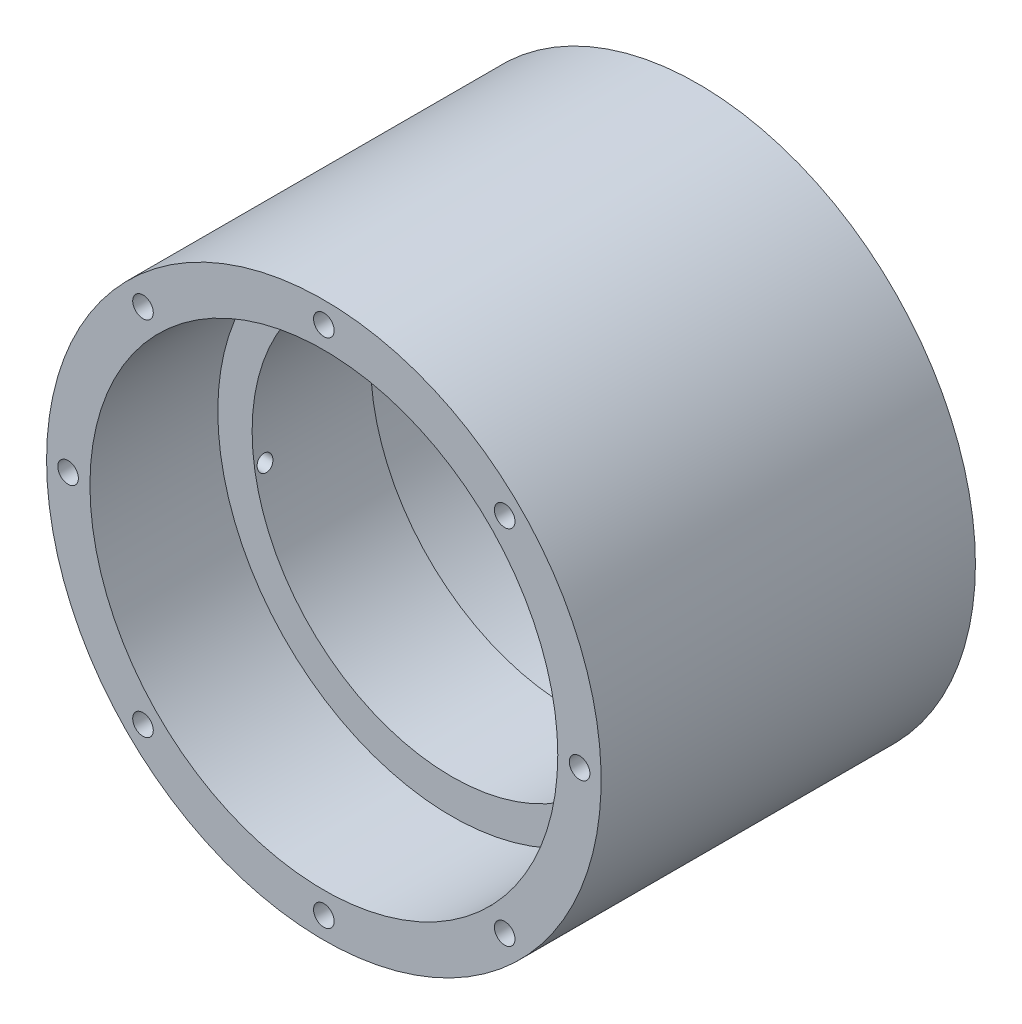
ISO-10303-21;
HEADER;
FILE_DESCRIPTION(('STEP AP214'),'2;1');
FILE_NAME('part.step','',(''),(''),'','','');
FILE_SCHEMA(('AUTOMOTIVE_DESIGN { 1 0 10303 214 1 1 1 1 }'));
ENDSEC;
DATA;
#1=APPLICATION_CONTEXT('core data for automotive mechanical design processes');
#2=APPLICATION_PROTOCOL_DEFINITION('international standard','automotive_design',2000,#1);
#3=PRODUCT_CONTEXT('',#1,'mechanical');
#4=PRODUCT('Part','Part','',(#3));
#5=PRODUCT_RELATED_PRODUCT_CATEGORY('part','',(#4));
#6=PRODUCT_DEFINITION_FORMATION('','',#4);
#7=PRODUCT_DEFINITION_CONTEXT('part definition',#1,'design');
#8=PRODUCT_DEFINITION('design','',#6,#7);
#9=PRODUCT_DEFINITION_SHAPE('','',#8);
#10=(LENGTH_UNIT() NAMED_UNIT(*) SI_UNIT(.MILLI.,.METRE.));
#11=(NAMED_UNIT(*) PLANE_ANGLE_UNIT() SI_UNIT($,.RADIAN.));
#12=(NAMED_UNIT(*) SI_UNIT($,.STERADIAN.) SOLID_ANGLE_UNIT());
#13=UNCERTAINTY_MEASURE_WITH_UNIT(LENGTH_MEASURE(1.E-05),#10,'distance_accuracy_value','');
#14=(GEOMETRIC_REPRESENTATION_CONTEXT(3) GLOBAL_UNCERTAINTY_ASSIGNED_CONTEXT((#13)) GLOBAL_UNIT_ASSIGNED_CONTEXT((#10,
#11,#12)) REPRESENTATION_CONTEXT('',''));
#15=CARTESIAN_POINT('',(0.,0.,0.));
#16=DIRECTION('',(0.,0.,1.));
#17=DIRECTION('',(1.,0.,0.));
#18=AXIS2_PLACEMENT_3D('',#15,#16,#17);
#19=CARTESIAN_POINT('',(-43.7241637998945,7.99999999999994,50.));
#20=DIRECTION('',(1.,0.,0.));
#21=DIRECTION('',(0.,0.,-1.));
#22=AXIS2_PLACEMENT_3D('',#19,#20,#21);
#23=PLANE('',#22);
#24=CARTESIAN_POINT('',(-43.7241637998945,5.14999999999991,15.5847480327554));
#25=DIRECTION('',(-1.,0.,0.));
#26=DIRECTION('',(0.,0.,1.));
#27=AXIS2_PLACEMENT_3D('',#24,#25,#26);
#28=CIRCLE('',#27,1.25);
#29=CARTESIAN_POINT('',(-43.7241637998945,5.14999999999991,16.8347480327554));
#30=VERTEX_POINT('',#29);
#31=EDGE_CURVE('E237',#30,#30,#28,.T.);
#32=ORIENTED_EDGE('',*,*,#31,.F.);
#33=EDGE_LOOP('',(#32));
#34=FACE_BOUND('',#33,.T.);
#35=DIRECTION('',(0.,-1.,0.));
#36=VECTOR('',#35,1.);
#37=CARTESIAN_POINT('',(-43.7241637998945,7.99999999999994,0.));
#38=LINE('',#37,#36);
#39=CARTESIAN_POINT('',(-43.7241637998945,7.99999999999996,0.));
#40=VERTEX_POINT('',#39);
#41=CARTESIAN_POINT('',(-43.7241637998945,-7.99999999999998,0.));
#42=VERTEX_POINT('',#41);
#43=EDGE_CURVE('E73',#40,#42,#38,.T.);
#44=ORIENTED_EDGE('',*,*,#43,.T.);
#45=DIRECTION('',(0.,0.,-1.));
#46=VECTOR('',#45,1.);
#47=CARTESIAN_POINT('',(-43.7241637998945,-7.99999999999998,50.));
#48=LINE('',#47,#46);
#49=CARTESIAN_POINT('',(-43.7241637998945,-7.99999999999998,50.));
#50=VERTEX_POINT('',#49);
#51=EDGE_CURVE('E66',#50,#42,#48,.T.);
#52=ORIENTED_EDGE('',*,*,#51,.F.);
#53=DIRECTION('',(0.,-1.,0.));
#54=VECTOR('',#53,1.);
#55=CARTESIAN_POINT('',(-43.7241637998945,7.99999999999994,50.));
#56=LINE('',#55,#54);
#57=CARTESIAN_POINT('',(-43.7241637998945,7.99999999999994,50.));
#58=VERTEX_POINT('',#57);
#59=EDGE_CURVE('E202',#58,#50,#56,.T.);
#60=ORIENTED_EDGE('',*,*,#59,.F.);
#61=DIRECTION('',(0.,0.,-1.));
#62=VECTOR('',#61,1.);
#63=CARTESIAN_POINT('',(-43.7241637998945,7.99999999999994,50.));
#64=LINE('',#63,#62);
#65=EDGE_CURVE('E60',#58,#40,#64,.T.);
#66=ORIENTED_EDGE('',*,*,#65,.T.);
#67=EDGE_LOOP('',(#44,#52,#60,#66));
#68=FACE_BOUND('',#67,.T.);
#69=CARTESIAN_POINT('',(-43.7241637998945,-5.05000000000007,37.8347480327554));
#70=DIRECTION('',(-1.,0.,0.));
#71=DIRECTION('',(0.,0.,1.));
#72=AXIS2_PLACEMENT_3D('',#69,#70,#71);
#73=CIRCLE('',#72,1.25);
#74=CARTESIAN_POINT('',(-43.7241637998945,-5.05000000000007,39.0847480327554));
#75=VERTEX_POINT('',#74);
#76=EDGE_CURVE('E228',#75,#75,#73,.T.);
#77=ORIENTED_EDGE('',*,*,#76,.F.);
#78=EDGE_LOOP('',(#77));
#79=FACE_BOUND('',#78,.T.);
#80=ADVANCED_FACE('F44',(#34,#68,#79),#23,.F.);
#81=CARTESIAN_POINT('',(0.,0.,60.));
#82=DIRECTION('',(0.,0.,-1.));
#83=DIRECTION('',(-1.,0.,0.));
#84=AXIS2_PLACEMENT_3D('',#81,#82,#83);
#85=CYLINDRICAL_SURFACE('',#84,44.45);
#86=ORIENTED_EDGE('',*,*,#51,.T.);
#87=CARTESIAN_POINT('',(0.,0.,0.));
#88=DIRECTION('',(0.,0.,-1.));
#89=DIRECTION('',(-1.,0.,0.));
#90=AXIS2_PLACEMENT_3D('',#87,#88,#89);
#91=CIRCLE('',#90,44.45);
#92=EDGE_CURVE('E53',#40,#42,#91,.T.);
#93=ORIENTED_EDGE('',*,*,#92,.F.);
#94=ORIENTED_EDGE('',*,*,#65,.F.);
#95=CARTESIAN_POINT('',(0.,0.,50.));
#96=DIRECTION('',(0.,0.,-1.));
#97=DIRECTION('',(-1.,0.,0.));
#98=AXIS2_PLACEMENT_3D('',#95,#96,#97);
#99=CIRCLE('',#98,44.45);
#100=EDGE_CURVE('E199',#50,#58,#99,.T.);
#101=ORIENTED_EDGE('',*,*,#100,.F.);
#102=EDGE_LOOP('',(#86,#93,#94,#101));
#103=FACE_BOUND('',#102,.T.);
#104=CARTESIAN_POINT('',(0.,0.,60.));
#105=DIRECTION('',(0.,0.,-1.));
#106=DIRECTION('',(-1.,0.,0.));
#107=AXIS2_PLACEMENT_3D('',#104,#105,#106);
#108=CIRCLE('',#107,44.45);
#109=CARTESIAN_POINT('',(-44.45,0.,60.));
#110=VERTEX_POINT('',#109);
#111=EDGE_CURVE('E11',#110,#110,#108,.T.);
#112=ORIENTED_EDGE('',*,*,#111,.T.);
#113=EDGE_LOOP('',(#112));
#114=FACE_BOUND('',#113,.T.);
#115=ADVANCED_FACE('F46',(#103,#114),#85,.T.);
#116=CARTESIAN_POINT('',(44.45,0.,60.));
#117=DIRECTION('',(0.,0.,1.));
#118=DIRECTION('',(1.,0.,0.));
#119=AXIS2_PLACEMENT_3D('',#116,#117,#118);
#120=PLANE('',#119);
#121=CARTESIAN_POINT('',(28.9913780286488,28.9913780286481,60.));
#122=DIRECTION('',(0.,0.,1.));
#123=DIRECTION('',(1.,0.,0.));
#124=AXIS2_PLACEMENT_3D('',#121,#122,#123);
#125=CIRCLE('',#124,1.65);
#126=CARTESIAN_POINT('',(30.6413780286488,28.9913780286481,60.));
#127=VERTEX_POINT('',#126);
#128=EDGE_CURVE('E110',#127,#127,#125,.T.);
#129=ORIENTED_EDGE('',*,*,#128,.F.);
#130=EDGE_LOOP('',(#129));
#131=FACE_BOUND('',#130,.T.);
#132=CARTESIAN_POINT('',(4.29452204677705E-13,41.,60.));
#133=DIRECTION('',(0.,0.,1.));
#134=DIRECTION('',(1.,0.,0.));
#135=AXIS2_PLACEMENT_3D('',#132,#133,#134);
#136=CIRCLE('',#135,1.65);
#137=CARTESIAN_POINT('',(1.65000000000043,41.,60.));
#138=VERTEX_POINT('',#137);
#139=EDGE_CURVE('E109',#138,#138,#136,.T.);
#140=ORIENTED_EDGE('',*,*,#139,.F.);
#141=EDGE_LOOP('',(#140));
#142=FACE_BOUND('',#141,.T.);
#143=CARTESIAN_POINT('',(-28.9913780286482,28.9913780286487,60.));
#144=DIRECTION('',(0.,0.,1.));
#145=DIRECTION('',(1.,0.,0.));
#146=AXIS2_PLACEMENT_3D('',#143,#144,#145);
#147=CIRCLE('',#146,1.65);
#148=CARTESIAN_POINT('',(-27.3413780286482,28.9913780286487,60.));
#149=VERTEX_POINT('',#148);
#150=EDGE_CURVE('E127',#149,#149,#147,.T.);
#151=ORIENTED_EDGE('',*,*,#150,.F.);
#152=EDGE_LOOP('',(#151));
#153=FACE_BOUND('',#152,.T.);
#154=CARTESIAN_POINT('',(-41.,2.86301469785137E-13,60.));
#155=DIRECTION('',(0.,0.,1.));
#156=DIRECTION('',(1.,0.,0.));
#157=AXIS2_PLACEMENT_3D('',#154,#155,#156);
#158=CIRCLE('',#157,1.65);
#159=CARTESIAN_POINT('',(-39.35,2.86301469785137E-13,60.));
#160=VERTEX_POINT('',#159);
#161=EDGE_CURVE('E135',#160,#160,#158,.T.);
#162=ORIENTED_EDGE('',*,*,#161,.F.);
#163=EDGE_LOOP('',(#162));
#164=FACE_BOUND('',#163,.T.);
#165=CARTESIAN_POINT('',(-28.9913780286486,-28.9913780286483,60.));
#166=DIRECTION('',(0.,0.,1.));
#167=DIRECTION('',(1.,0.,0.));
#168=AXIS2_PLACEMENT_3D('',#165,#166,#167);
#169=CIRCLE('',#168,1.65);
#170=CARTESIAN_POINT('',(-27.3413780286486,-28.9913780286483,60.));
#171=VERTEX_POINT('',#170);
#172=EDGE_CURVE('E143',#171,#171,#169,.T.);
#173=ORIENTED_EDGE('',*,*,#172,.F.);
#174=EDGE_LOOP('',(#173));
#175=FACE_BOUND('',#174,.T.);
#176=CARTESIAN_POINT('',(-1.43150734892569E-13,-41.,60.));
#177=DIRECTION('',(0.,0.,1.));
#178=DIRECTION('',(1.,0.,0.));
#179=AXIS2_PLACEMENT_3D('',#176,#177,#178);
#180=CIRCLE('',#179,1.65);
#181=CARTESIAN_POINT('',(1.64999999999986,-41.,60.));
#182=VERTEX_POINT('',#181);
#183=EDGE_CURVE('E151',#182,#182,#180,.T.);
#184=ORIENTED_EDGE('',*,*,#183,.F.);
#185=EDGE_LOOP('',(#184));
#186=FACE_BOUND('',#185,.T.);
#187=CARTESIAN_POINT('',(28.9913780286484,-28.9913780286485,60.));
#188=DIRECTION('',(0.,0.,1.));
#189=DIRECTION('',(1.,0.,0.));
#190=AXIS2_PLACEMENT_3D('',#187,#188,#189);
#191=CIRCLE('',#190,1.65);
#192=CARTESIAN_POINT('',(30.6413780286484,-28.9913780286485,60.));
#193=VERTEX_POINT('',#192);
#194=EDGE_CURVE('E159',#193,#193,#191,.T.);
#195=ORIENTED_EDGE('',*,*,#194,.F.);
#196=EDGE_LOOP('',(#195));
#197=FACE_BOUND('',#196,.T.);
#198=CARTESIAN_POINT('',(41.,0.,60.));
#199=DIRECTION('',(0.,0.,1.));
#200=DIRECTION('',(1.,0.,0.));
#201=AXIS2_PLACEMENT_3D('',#198,#199,#200);
#202=CIRCLE('',#201,1.65);
#203=CARTESIAN_POINT('',(42.65,0.,60.));
#204=VERTEX_POINT('',#203);
#205=EDGE_CURVE('E167',#204,#204,#202,.T.);
#206=ORIENTED_EDGE('',*,*,#205,.F.);
#207=EDGE_LOOP('',(#206));
#208=FACE_BOUND('',#207,.T.);
#209=CARTESIAN_POINT('',(0.,0.,60.));
#210=DIRECTION('',(0.,0.,-1.));
#211=DIRECTION('',(-1.,0.,0.));
#212=AXIS2_PLACEMENT_3D('',#209,#210,#211);
#213=CIRCLE('',#212,37.5);
#214=CARTESIAN_POINT('',(-37.5,0.,60.));
#215=VERTEX_POINT('',#214);
#216=EDGE_CURVE('E195',#215,#215,#213,.T.);
#217=ORIENTED_EDGE('',*,*,#216,.T.);
#218=EDGE_LOOP('',(#217));
#219=FACE_BOUND('',#218,.T.);
#220=ORIENTED_EDGE('',*,*,#111,.F.);
#221=EDGE_LOOP('',(#220));
#222=FACE_BOUND('',#221,.T.);
#223=ADVANCED_FACE('F282',(#131,#142,#153,#164,#175,#186,#197,#208,#219,#222),#120,.T.);
#224=CARTESIAN_POINT('',(0.,0.,0.));
#225=DIRECTION('',(0.,0.,-1.));
#226=DIRECTION('',(-1.,0.,0.));
#227=AXIS2_PLACEMENT_3D('',#224,#225,#226);
#228=PLANE('',#227);
#229=CARTESIAN_POINT('',(0.,0.,0.));
#230=DIRECTION('',(0.,0.,-1.));
#231=DIRECTION('',(-1.,0.,0.));
#232=AXIS2_PLACEMENT_3D('',#229,#230,#231);
#233=CIRCLE('',#232,37.5);
#234=CARTESIAN_POINT('',(-37.5,0.,0.));
#235=VERTEX_POINT('',#234);
#236=EDGE_CURVE('E191',#235,#235,#233,.T.);
#237=ORIENTED_EDGE('',*,*,#236,.F.);
#238=EDGE_LOOP('',(#237));
#239=FACE_BOUND('',#238,.T.);
#240=ORIENTED_EDGE('',*,*,#43,.F.);
#241=ORIENTED_EDGE('',*,*,#92,.T.);
#242=EDGE_LOOP('',(#240,#241));
#243=FACE_BOUND('',#242,.T.);
#244=ADVANCED_FACE('F216',(#239,#243),#228,.T.);
#245=CARTESIAN_POINT('',(0.,0.,50.));
#246=DIRECTION('',(0.,0.,-1.));
#247=DIRECTION('',(-1.,0.,0.));
#248=AXIS2_PLACEMENT_3D('',#245,#246,#247);
#249=PLANE('',#248);
#250=ORIENTED_EDGE('',*,*,#100,.T.);
#251=ORIENTED_EDGE('',*,*,#59,.T.);
#252=EDGE_LOOP('',(#250,#251));
#253=FACE_BOUND('',#252,.T.);
#254=ADVANCED_FACE('F221',(#253),#249,.T.);
#255=CARTESIAN_POINT('',(0.,0.,60.));
#256=DIRECTION('',(0.,0.,-1.));
#257=DIRECTION('',(-1.,0.,0.));
#258=AXIS2_PLACEMENT_3D('',#255,#256,#257);
#259=CYLINDRICAL_SURFACE('',#258,37.5);
#260=ORIENTED_EDGE('',*,*,#216,.F.);
#261=EDGE_LOOP('',(#260));
#262=FACE_BOUND('',#261,.T.);
#263=CARTESIAN_POINT('',(0.,0.,39.5));
#264=DIRECTION('',(0.,0.,-1.));
#265=DIRECTION('',(-1.,0.,0.));
#266=AXIS2_PLACEMENT_3D('',#263,#264,#265);
#267=CIRCLE('',#266,37.5);
#268=CARTESIAN_POINT('',(-37.5,0.,39.5));
#269=VERTEX_POINT('',#268);
#270=EDGE_CURVE('E175',#269,#269,#267,.T.);
#271=ORIENTED_EDGE('',*,*,#270,.T.);
#272=EDGE_LOOP('',(#271));
#273=FACE_BOUND('',#272,.T.);
#274=ADVANCED_FACE('F276',(#262,#273),#259,.F.);
#275=CARTESIAN_POINT('',(0.,0.,60.));
#276=DIRECTION('',(0.,0.,-1.));
#277=DIRECTION('',(-1.,0.,0.));
#278=AXIS2_PLACEMENT_3D('',#275,#276,#277);
#279=CYLINDRICAL_SURFACE('',#278,37.5);
#280=CARTESIAN_POINT('',(-37.144683334227,5.14999999999991,16.8347480327554));
#281=CARTESIAN_POINT('',(-37.1348528911148,5.22090051073942,16.8347449450375));
#282=CARTESIAN_POINT('',(-37.1248106513063,5.29182459819323,16.8286963232049));
#283=CARTESIAN_POINT('',(-37.1046086195653,5.43166899050378,16.8046693009774));
#284=CARTESIAN_POINT('',(-37.0944486964647,5.50058668172742,16.7866760082665));
#285=CARTESIAN_POINT('',(-37.0743616385239,5.63438406331942,16.7392631093398));
#286=CARTESIAN_POINT('',(-37.0644344074721,5.69926544161952,16.7098483172179));
#287=CARTESIAN_POINT('',(-37.0451732269609,5.82314994177626,16.6404046422333));
#288=CARTESIAN_POINT('',(-37.0358391210029,5.88215461657674,16.6003785737378));
#289=CARTESIAN_POINT('',(-37.0181484620944,5.99247897915528,16.5109025120551));
#290=CARTESIAN_POINT('',(-37.0097898163284,6.04381518822894,16.4614733158417));
#291=CARTESIAN_POINT('',(-36.994379464664,6.13743799182849,16.3544997378289));
#292=CARTESIAN_POINT('',(-36.9873277433184,6.17972469331536,16.2969554519593));
#293=CARTESIAN_POINT('',(-36.9749153479508,6.25356115348532,16.1760328728788));
#294=CARTESIAN_POINT('',(-36.9695374310235,6.28522067548757,16.1127233902448));
#295=CARTESIAN_POINT('',(-36.9606212604343,6.33744290485987,15.9815612417574));
#296=CARTESIAN_POINT('',(-36.9570828495687,6.35800656048573,15.9137089646897));
#297=CARTESIAN_POINT('',(-36.9520492466531,6.38719617492574,15.7763487578726));
#298=CARTESIAN_POINT('',(-36.9505277219078,6.39597600407856,15.7068744677431));
#299=CARTESIAN_POINT('',(-36.9495145861352,6.40182641977569,15.5674216524102));
#300=CARTESIAN_POINT('',(-36.9500228646396,6.39889764353856,15.4974431548543));
#301=CARTESIAN_POINT('',(-36.9530336945292,6.38148698474806,15.3594951754045));
#302=CARTESIAN_POINT('',(-36.9555219470029,6.36708793701473,15.2915148995373));
#303=CARTESIAN_POINT('',(-36.9623580246327,6.32728170100281,15.1589581923875));
#304=CARTESIAN_POINT('',(-36.9667058695097,6.30187439598113,15.0943817972114));
#305=CARTESIAN_POINT('',(-36.9770827601659,6.24069803024955,14.970184866816));
#306=CARTESIAN_POINT('',(-36.983118082518,6.20489026534491,14.9105839338025));
#307=CARTESIAN_POINT('',(-36.9965981456411,6.12400209385605,14.798228800226));
#308=CARTESIAN_POINT('',(-37.0040429693984,6.07892114128648,14.745475003106));
#309=CARTESIAN_POINT('',(-37.0201292159303,5.98018050394595,14.6476308799104));
#310=CARTESIAN_POINT('',(-37.0287839028091,5.92642453564731,14.6026399100731));
#311=CARTESIAN_POINT('',(-37.0468765562931,5.81225203153842,14.522300033647));
#312=CARTESIAN_POINT('',(-37.0563145776811,5.75183502978858,14.4869518021697));
#313=CARTESIAN_POINT('',(-37.0757453062318,5.62523391871105,14.4264584466028));
#314=CARTESIAN_POINT('',(-37.0857434329323,5.55898768513162,14.4014450215018));
#315=CARTESIAN_POINT('',(-37.105837369471,5.42324059699343,14.3629388696798));
#316=CARTESIAN_POINT('',(-37.1159331832372,5.35373961112239,14.3494466082008));
#317=CARTESIAN_POINT('',(-37.1359611780551,5.21300936433585,14.3343211631203));
#318=CARTESIAN_POINT('',(-37.1458920406966,5.14177232097842,14.3327584832582));
#319=CARTESIAN_POINT('',(-37.1652413669283,4.99999535897764,14.3417501007413));
#320=CARTESIAN_POINT('',(-37.1746598327812,4.9294554372568,14.3523043445714));
#321=CARTESIAN_POINT('',(-37.1927245810604,4.79125109340386,14.3852338469232));
#322=CARTESIAN_POINT('',(-37.2013725018675,4.72358073868491,14.4075832890255));
#323=CARTESIAN_POINT('',(-37.2177300857738,4.59291914330473,14.4634942945913));
#324=CARTESIAN_POINT('',(-37.2254397815039,4.52992773994222,14.4970554679657));
#325=CARTESIAN_POINT('',(-37.2397305630399,4.41090027827991,14.5741909051058));
#326=CARTESIAN_POINT('',(-37.2463192036033,4.35481842717961,14.617693101265));
#327=CARTESIAN_POINT('',(-37.2583397294966,4.25074937895235,14.713624643073));
#328=CARTESIAN_POINT('',(-37.2637716609072,4.20276185938028,14.7660536329475));
#329=CARTESIAN_POINT('',(-37.2733846739309,4.11663268167229,14.877925374925));
#330=CARTESIAN_POINT('',(-37.2775748230358,4.0784199439265,14.9373126302776));
#331=CARTESIAN_POINT('',(-37.2847278907407,4.01250176038569,15.0617249423557));
#332=CARTESIAN_POINT('',(-37.2876908482523,3.98479598144006,15.1267498202451));
#333=CARTESIAN_POINT('',(-37.2923630418455,3.94083091658892,15.260216685987));
#334=CARTESIAN_POINT('',(-37.294078885748,3.92451131982481,15.3286385808647));
#335=CARTESIAN_POINT('',(-37.2962777184731,3.90356006865422,15.4672682188042));
#336=CARTESIAN_POINT('',(-37.2967607269552,3.89892822786912,15.5374759333703));
#337=CARTESIAN_POINT('',(-37.2964933123858,3.90148533965297,15.6774920819659));
#338=CARTESIAN_POINT('',(-37.2957460548888,3.9086439546308,15.7473010783946));
#339=CARTESIAN_POINT('',(-37.2930256755793,3.93451432165205,15.8847193049675));
#340=CARTESIAN_POINT('',(-37.2910525577753,3.9532260359185,15.9523285423038));
#341=CARTESIAN_POINT('',(-37.285886575909,4.00165607824828,16.0834365931672));
#342=CARTESIAN_POINT('',(-37.282693640832,4.03137504712506,16.1469351671293));
#343=CARTESIAN_POINT('',(-37.2751046064624,4.10095060576331,16.2680278489174));
#344=CARTESIAN_POINT('',(-37.2707085462307,4.14080686640329,16.3256221483487));
#345=CARTESIAN_POINT('',(-37.2607349755815,4.22961286855186,16.433439906076));
#346=CARTESIAN_POINT('',(-37.2551544982269,4.27858540752631,16.4836443077821));
#347=CARTESIAN_POINT('',(-37.2428785516507,4.3841550189487,16.5751323321814));
#348=CARTESIAN_POINT('',(-37.2361827842689,4.44075412949945,16.6164135625664));
#349=CARTESIAN_POINT('',(-37.221733265501,4.56028678918127,16.6891315414998));
#350=CARTESIAN_POINT('',(-37.2139735623147,4.62325540998597,16.7205093741549));
#351=CARTESIAN_POINT('',(-37.197572847733,4.75340502453665,16.7722266841077));
#352=CARTESIAN_POINT('',(-37.1889328518474,4.82058113078724,16.792578713305));
#353=CARTESIAN_POINT('',(-37.1743078287966,4.93180720303171,16.8163415002608));
#354=CARTESIAN_POINT('',(-37.1685297672093,4.97517127671192,16.8232375260163));
#355=CARTESIAN_POINT('',(-37.1567558924915,5.0623538965539,16.8324417518368));
#356=CARTESIAN_POINT('',(-37.1507600788648,5.1061724437512,16.8347499414459));
#357=CARTESIAN_POINT('',(-37.144683334227,5.14999999999991,16.8347480327554));
#358=B_SPLINE_CURVE_WITH_KNOTS('',3,(#280,#281,#282,#283,#284,#285,#286,#287,#288,#289,#290,
#291,#292,#293,#294,#295,#296,#297,#298,#299,#300,#301,#302,#303,#304,#305,#306,#307,#308,#309,
#310,#311,#312,#313,#314,#315,#316,#317,#318,#319,#320,#321,#322,#323,#324,#325,#326,#327,#328,
#329,#330,#331,#332,#333,#334,#335,#336,#337,#338,#339,#340,#341,#342,#343,#344,#345,#346,#347,
#348,#349,#350,#351,#352,#353,#354,#355,#356,#357),.UNSPECIFIED.,.T.,.F.,(4,2,2,2,2,2,2,2,2,2,2,
2,2,2,2,2,2,2,2,2,2,2,2,2,2,2,2,2,2,2,2,2,2,2,2,2,2,2,4),(0.,0.214574812460328,
0.429417655127947,0.644170040946642,0.858865526122734,1.07309157499614,1.28731509167715,
1.4992525290231,1.71117185126717,1.92029614915833,2.1294090660125,2.3370253758153,
2.54464388745265,2.75304515124106,2.96145868876164,3.17236847438737,3.38329302253364,
3.59682818625761,3.81037197244645,4.02517683103881,4.23998074093475,4.4543164425756,
4.66864468762421,4.88146585846979,5.09427854938613,5.30549666204985,5.5167080769306,
5.72679206547088,5.93687270388894,6.14641363549444,6.35595388193479,6.56550632917577,
6.77505197386896,6.98512885488306,7.19526198798588,7.40662262819548,7.61774214472139,
7.75038249007075,7.88302313771307),.UNSPECIFIED.);
#359=CARTESIAN_POINT('',(-37.144683334227,5.14999999999991,16.8347480327554));
#360=VERTEX_POINT('',#359);
#361=EDGE_CURVE('E120',#360,#360,#358,.T.);
#362=ORIENTED_EDGE('',*,*,#361,.T.);
#363=EDGE_LOOP('',(#362));
#364=FACE_BOUND('',#363,.T.);
#365=CARTESIAN_POINT('',(0.,0.,20.5));
#366=DIRECTION('',(0.,0.,-1.));
#367=DIRECTION('',(-1.,0.,0.));
#368=AXIS2_PLACEMENT_3D('',#365,#366,#367);
#369=CIRCLE('',#368,37.5);
#370=CARTESIAN_POINT('',(-37.5,0.,20.5));
#371=VERTEX_POINT('',#370);
#372=EDGE_CURVE('E187',#371,#371,#369,.T.);
#373=ORIENTED_EDGE('',*,*,#372,.F.);
#374=EDGE_LOOP('',(#373));
#375=FACE_BOUND('',#374,.T.);
#376=ORIENTED_EDGE('',*,*,#236,.T.);
#377=EDGE_LOOP('',(#376));
#378=FACE_BOUND('',#377,.T.);
#379=ADVANCED_FACE('F270',(#364,#375,#378),#279,.F.);
#380=CARTESIAN_POINT('',(37.5,0.,20.5));
#381=DIRECTION('',(0.,0.,1.));
#382=DIRECTION('',(1.,0.,0.));
#383=AXIS2_PLACEMENT_3D('',#380,#381,#382);
#384=PLANE('',#383);
#385=CARTESIAN_POINT('',(0.,0.,20.5));
#386=DIRECTION('',(0.,0.,-1.));
#387=DIRECTION('',(-1.,0.,0.));
#388=AXIS2_PLACEMENT_3D('',#385,#386,#387);
#389=CIRCLE('',#388,32.);
#390=CARTESIAN_POINT('',(-32.,0.,20.5));
#391=VERTEX_POINT('',#390);
#392=EDGE_CURVE('E183',#391,#391,#389,.T.);
#393=ORIENTED_EDGE('',*,*,#392,.F.);
#394=EDGE_LOOP('',(#393));
#395=FACE_BOUND('',#394,.T.);
#396=ORIENTED_EDGE('',*,*,#372,.T.);
#397=EDGE_LOOP('',(#396));
#398=FACE_BOUND('',#397,.T.);
#399=ADVANCED_FACE('F262',(#395,#398),#384,.F.);
#400=CARTESIAN_POINT('',(0.,0.,60.));
#401=DIRECTION('',(0.,0.,-1.));
#402=DIRECTION('',(-1.,0.,0.));
#403=AXIS2_PLACEMENT_3D('',#400,#401,#402);
#404=CYLINDRICAL_SURFACE('',#403,32.);
#405=CARTESIAN_POINT('',(-31.5990110604746,-5.05000000000007,39.0847480327554));
#406=CARTESIAN_POINT('',(-31.6102891033159,-4.97942858720738,39.0847450608575));
#407=CARTESIAN_POINT('',(-31.6213366783599,-4.90877038482602,39.0787530651163));
#408=CARTESIAN_POINT('',(-31.6426713540702,-4.76931246784278,39.0548829999618));
#409=CARTESIAN_POINT('',(-31.6529575908903,-4.70051491890359,39.0369916520221));
#410=CARTESIAN_POINT('',(-31.6725244643878,-4.56681061042861,38.9897598570429));
#411=CARTESIAN_POINT('',(-31.6818051551345,-4.50190364177588,38.960420025992));
#412=CARTESIAN_POINT('',(-31.6991778737891,-4.37790436767826,38.8910777595899));
#413=CARTESIAN_POINT('',(-31.7072702117634,-4.31881054679375,38.8510781133037));
#414=CARTESIAN_POINT('',(-31.722087434473,-4.20859167579249,38.7618521571332));
#415=CARTESIAN_POINT('',(-31.728821994585,-4.15741089639364,38.7126963098968));
#416=CARTESIAN_POINT('',(-31.7409188447558,-4.06402436722577,38.6063434898743));
#417=CARTESIAN_POINT('',(-31.7462811485182,-4.02181852783235,38.5491465973963));
#418=CARTESIAN_POINT('',(-31.7555456181635,-3.94799936908926,38.4289076926337));
#419=CARTESIAN_POINT('',(-31.7594607788446,-3.91629205986199,38.3659243746026));
#420=CARTESIAN_POINT('',(-31.7658792481159,-3.86388624562626,38.235466162245));
#421=CARTESIAN_POINT('',(-31.7683826098751,-3.84318732603793,38.1679914371741));
#422=CARTESIAN_POINT('',(-31.7719593765968,-3.81350518594545,38.0308898226099));
#423=CARTESIAN_POINT('',(-31.7730410413861,-3.80445429874435,37.9612777909705));
#424=CARTESIAN_POINT('',(-31.7737995783917,-3.7981141654517,37.8215131287053));
#425=CARTESIAN_POINT('',(-31.7734764776757,-3.8008246927353,37.7513605085219));
#426=CARTESIAN_POINT('',(-31.7714283201624,-3.8179071073419,37.6126717390764));
#427=CARTESIAN_POINT('',(-31.7697064129067,-3.83225279691033,37.5441323139243));
#428=CARTESIAN_POINT('',(-31.7648685060241,-3.87214788568632,37.4104484346043));
#429=CARTESIAN_POINT('',(-31.7617525086584,-3.89769726672187,37.34530397493));
#430=CARTESIAN_POINT('',(-31.7541345343057,-3.9592800869544,37.2201769576665));
#431=CARTESIAN_POINT('',(-31.7496310724579,-3.99532475590017,37.1602000187676));
#432=CARTESIAN_POINT('',(-31.7392682252595,-4.07682898206509,37.0471607802378));
#433=CARTESIAN_POINT('',(-31.733408820624,-4.1222886731884,36.9940985789686));
#434=CARTESIAN_POINT('',(-31.7203600243388,-4.2215245657487,36.8961256809254));
#435=CARTESIAN_POINT('',(-31.7131647446278,-4.27533740571379,36.8512528875535));
#436=CARTESIAN_POINT('',(-31.6975551512946,-4.38956895748419,36.7711705720993));
#437=CARTESIAN_POINT('',(-31.6891407933419,-4.44998790949476,36.7359614015601));
#438=CARTESIAN_POINT('',(-31.6711594588842,-4.57621572932683,36.6758894999452));
#439=CARTESIAN_POINT('',(-31.6615837440788,-4.64206409235134,36.6511123929175));
#440=CARTESIAN_POINT('',(-31.6415287335983,-4.77685042253994,36.6129476285321));
#441=CARTESIAN_POINT('',(-31.6310493872883,-4.84578856273535,36.5995606098744));
#442=CARTESIAN_POINT('',(-31.609325115038,-4.98554060871946,36.5844140839569));
#443=CARTESIAN_POINT('',(-31.5980734734273,-5.05636647246416,36.5827745060373));
#444=CARTESIAN_POINT('',(-31.5752108488912,-5.19722548019936,36.5914441175516));
#445=CARTESIAN_POINT('',(-31.5635998453115,-5.26725857830859,36.6017539950256));
#446=CARTESIAN_POINT('',(-31.5402806677472,-5.40514811098539,36.6341539980978));
#447=CARTESIAN_POINT('',(-31.5285724713679,-5.47298221490968,36.6563392345689));
#448=CARTESIAN_POINT('',(-31.505556714952,-5.60395588744305,36.7119415119903));
#449=CARTESIAN_POINT('',(-31.4942491635228,-5.66709535522659,36.7453587940836));
#450=CARTESIAN_POINT('',(-31.4724600537168,-5.7868790795586,36.8225299746293));
#451=CARTESIAN_POINT('',(-31.4619785808262,-5.84352266416095,36.8662849410008));
#452=CARTESIAN_POINT('',(-31.4422734825977,-5.94863881470916,36.9629422502653));
#453=CARTESIAN_POINT('',(-31.433049793713,-5.9971117934869,37.0158441307232));
#454=CARTESIAN_POINT('',(-31.4163623768435,-6.08392251317164,37.1286917037353));
#455=CARTESIAN_POINT('',(-31.4088802354395,-6.1223668661856,37.1885526163383));
#456=CARTESIAN_POINT('',(-31.3958935952915,-6.18861944999392,37.3140931974283));
#457=CARTESIAN_POINT('',(-31.3903888793575,-6.21642884889723,37.3797722258956));
#458=CARTESIAN_POINT('',(-31.3817042582696,-6.26012208309219,37.5138325814496));
#459=CARTESIAN_POINT('',(-31.3784847912082,-6.27620899388858,37.5821451768007));
#460=CARTESIAN_POINT('',(-31.3743716959006,-6.29673826280626,37.7205650304702));
#461=CARTESIAN_POINT('',(-31.3734778592658,-6.30118166424754,37.7906721274232));
#462=CARTESIAN_POINT('',(-31.3740562876324,-6.29830080588364,37.9296985415372));
#463=CARTESIAN_POINT('',(-31.3754972964885,-6.29113199695903,37.9986212707544));
#464=CARTESIAN_POINT('',(-31.3806162831636,-6.26554783436724,38.1342582281655));
#465=CARTESIAN_POINT('',(-31.3842942360331,-6.24713260613572,38.2009724809826));
#466=CARTESIAN_POINT('',(-31.3937139314897,-6.19962160994404,38.3303499302796));
#467=CARTESIAN_POINT('',(-31.3994564146972,-6.17052200904079,38.3930116634468));
#468=CARTESIAN_POINT('',(-31.4127425869514,-6.1025239284884,38.5125553358801));
#469=CARTESIAN_POINT('',(-31.4202863180386,-6.06362522013087,38.5694371402008));
#470=CARTESIAN_POINT('',(-31.4369607266685,-5.97657802420915,38.6766413739151));
#471=CARTESIAN_POINT('',(-31.4461113125776,-5.92831258708007,38.7268657066191));
#472=CARTESIAN_POINT('',(-31.465552072119,-5.82424501402477,38.8185443696361));
#473=CARTESIAN_POINT('',(-31.4758426247834,-5.76844036999579,38.8599957695885));
#474=CARTESIAN_POINT('',(-31.4973575872857,-5.64979312328791,38.9337088700856));
#475=CARTESIAN_POINT('',(-31.5085954842139,-5.58684181270977,38.9657915019498));
#476=CARTESIAN_POINT('',(-31.5314201033916,-5.45654692219903,39.0188757689499));
#477=CARTESIAN_POINT('',(-31.5430064337641,-5.38920818407186,39.039889394269));
#478=CARTESIAN_POINT('',(-31.5620549458802,-5.27624155277635,39.0649456578556));
#479=CARTESIAN_POINT('',(-31.5695300613221,-5.23133520131989,39.0723601082684));
#480=CARTESIAN_POINT('',(-31.5843724065202,-5.14096459584863,39.082262276057));
#481=CARTESIAN_POINT('',(-31.5917396352997,-5.09550033679039,39.0847499488621));
#482=CARTESIAN_POINT('',(-31.5990110604746,-5.05000000000007,39.0847480327554));
#483=B_SPLINE_CURVE_WITH_KNOTS('',3,(#405,#406,#407,#408,#409,#410,#411,#412,#413,#414,#415,
#416,#417,#418,#419,#420,#421,#422,#423,#424,#425,#426,#427,#428,#429,#430,#431,#432,#433,#434,
#435,#436,#437,#438,#439,#440,#441,#442,#443,#444,#445,#446,#447,#448,#449,#450,#451,#452,#453,
#454,#455,#456,#457,#458,#459,#460,#461,#462,#463,#464,#465,#466,#467,#468,#469,#470,#471,#472,
#473,#474,#475,#476,#477,#478,#479,#480,#481,#482),.UNSPECIFIED.,.T.,.F.,(4,2,2,2,2,2,2,2,2,2,2,
2,2,2,2,2,2,2,2,2,2,2,2,2,2,2,2,2,2,2,2,2,2,2,2,2,2,2,4),(0.,0.214234628204966,
0.428708723549191,0.643171280651084,0.857577780143764,1.0703977816709,1.28321565786225,
1.49407320299883,1.70492280660286,1.91454191287913,2.124156980127,2.33330138361533,
2.54244544787963,2.75181411965185,2.96118576935258,3.17150316081171,3.38182820217963,
3.5938473924941,3.80587847101544,4.02007112515878,4.23427611295919,4.45022293605881,
4.66617439565589,4.88214817355862,5.09811103579571,5.31167472382465,5.52521494796717,
5.73496173973724,5.94468973644324,6.15163326600328,6.35857448748433,6.5655900203155,
6.77261038527799,6.98240449965128,7.19226857985574,7.40591461079641,7.61932873742057,
7.75745349880432,7.8955795097446),.UNSPECIFIED.);
#484=CARTESIAN_POINT('',(-31.5990110604746,-5.05000000000007,39.0847480327554));
#485=VERTEX_POINT('',#484);
#486=EDGE_CURVE('E231',#485,#485,#483,.T.);
#487=ORIENTED_EDGE('',*,*,#486,.T.);
#488=EDGE_LOOP('',(#487));
#489=FACE_BOUND('',#488,.T.);
#490=CARTESIAN_POINT('',(0.,0.,39.5));
#491=DIRECTION('',(0.,0.,-1.));
#492=DIRECTION('',(-1.,0.,0.));
#493=AXIS2_PLACEMENT_3D('',#490,#491,#492);
#494=CIRCLE('',#493,32.);
#495=CARTESIAN_POINT('',(-32.,0.,39.5));
#496=VERTEX_POINT('',#495);
#497=EDGE_CURVE('E179',#496,#496,#494,.T.);
#498=ORIENTED_EDGE('',*,*,#497,.F.);
#499=EDGE_LOOP('',(#498));
#500=FACE_BOUND('',#499,.T.);
#501=ORIENTED_EDGE('',*,*,#392,.T.);
#502=EDGE_LOOP('',(#501));
#503=FACE_BOUND('',#502,.T.);
#504=ADVANCED_FACE('F258',(#489,#500,#503),#404,.F.);
#505=CARTESIAN_POINT('',(32.,0.,39.5));
#506=DIRECTION('',(0.,0.,-1.));
#507=DIRECTION('',(-1.,0.,0.));
#508=AXIS2_PLACEMENT_3D('',#505,#506,#507);
#509=PLANE('',#508);
#510=ORIENTED_EDGE('',*,*,#270,.F.);
#511=EDGE_LOOP('',(#510));
#512=FACE_BOUND('',#511,.T.);
#513=ORIENTED_EDGE('',*,*,#497,.T.);
#514=EDGE_LOOP('',(#513));
#515=FACE_BOUND('',#514,.T.);
#516=ADVANCED_FACE('F261',(#512,#515),#509,.F.);
#517=CARTESIAN_POINT('',(41.,0.,50.));
#518=DIRECTION('',(0.,0.,1.));
#519=DIRECTION('',(1.,0.,0.));
#520=AXIS2_PLACEMENT_3D('',#517,#518,#519);
#521=CONICAL_SURFACE('',#520,1.65,1.02974425867665);
#522=CARTESIAN_POINT('',(41.,0.,49.0085799786045));
#523=VERTEX_POINT('',#522);
#524=VERTEX_LOOP('',#523);
#525=FACE_BOUND('',#524,.T.);
#526=CARTESIAN_POINT('',(41.,0.,50.));
#527=DIRECTION('',(0.,0.,1.));
#528=DIRECTION('',(1.,0.,0.));
#529=AXIS2_PLACEMENT_3D('',#526,#527,#528);
#530=CIRCLE('',#529,1.65);
#531=CARTESIAN_POINT('',(42.65,0.,50.));
#532=VERTEX_POINT('',#531);
#533=EDGE_CURVE('E171',#532,#532,#530,.T.);
#534=ORIENTED_EDGE('',*,*,#533,.T.);
#535=EDGE_LOOP('',(#534));
#536=FACE_BOUND('',#535,.T.);
#537=ADVANCED_FACE('F296',(#525,#536),#521,.F.);
#538=CARTESIAN_POINT('',(41.,0.,60.));
#539=DIRECTION('',(0.,0.,1.));
#540=DIRECTION('',(1.,0.,0.));
#541=AXIS2_PLACEMENT_3D('',#538,#539,#540);
#542=CYLINDRICAL_SURFACE('',#541,1.65);
#543=ORIENTED_EDGE('',*,*,#533,.F.);
#544=EDGE_LOOP('',(#543));
#545=FACE_BOUND('',#544,.T.);
#546=ORIENTED_EDGE('',*,*,#205,.T.);
#547=EDGE_LOOP('',(#546));
#548=FACE_BOUND('',#547,.T.);
#549=ADVANCED_FACE('F300',(#545,#548),#542,.F.);
#550=CARTESIAN_POINT('',(28.9913780286484,-28.9913780286485,50.));
#551=DIRECTION('',(0.,0.,1.));
#552=DIRECTION('',(1.,0.,0.));
#553=AXIS2_PLACEMENT_3D('',#550,#551,#552);
#554=CONICAL_SURFACE('',#553,1.65,1.02974425867665);
#555=CARTESIAN_POINT('',(28.9913780286484,-28.9913780286485,49.0085799786045));
#556=VERTEX_POINT('',#555);
#557=VERTEX_LOOP('',#556);
#558=FACE_BOUND('',#557,.T.);
#559=CARTESIAN_POINT('',(28.9913780286484,-28.9913780286485,50.));
#560=DIRECTION('',(0.,0.,1.));
#561=DIRECTION('',(1.,0.,0.));
#562=AXIS2_PLACEMENT_3D('',#559,#560,#561);
#563=CIRCLE('',#562,1.65);
#564=CARTESIAN_POINT('',(30.6413780286484,-28.9913780286485,50.));
#565=VERTEX_POINT('',#564);
#566=EDGE_CURVE('E163',#565,#565,#563,.T.);
#567=ORIENTED_EDGE('',*,*,#566,.T.);
#568=EDGE_LOOP('',(#567));
#569=FACE_BOUND('',#568,.T.);
#570=ADVANCED_FACE('F303',(#558,#569),#554,.F.);
#571=CARTESIAN_POINT('',(28.9913780286484,-28.9913780286485,60.));
#572=DIRECTION('',(0.,0.,1.));
#573=DIRECTION('',(1.,0.,0.));
#574=AXIS2_PLACEMENT_3D('',#571,#572,#573);
#575=CYLINDRICAL_SURFACE('',#574,1.65);
#576=ORIENTED_EDGE('',*,*,#566,.F.);
#577=EDGE_LOOP('',(#576));
#578=FACE_BOUND('',#577,.T.);
#579=ORIENTED_EDGE('',*,*,#194,.T.);
#580=EDGE_LOOP('',(#579));
#581=FACE_BOUND('',#580,.T.);
#582=ADVANCED_FACE('F307',(#578,#581),#575,.F.);
#583=CARTESIAN_POINT('',(-1.43150734892569E-13,-41.,50.));
#584=DIRECTION('',(0.,0.,1.));
#585=DIRECTION('',(1.,0.,0.));
#586=AXIS2_PLACEMENT_3D('',#583,#584,#585);
#587=CONICAL_SURFACE('',#586,1.65,1.02974425867665);
#588=CARTESIAN_POINT('',(-1.45842856362026E-13,-41.,49.0085799786045));
#589=VERTEX_POINT('',#588);
#590=VERTEX_LOOP('',#589);
#591=FACE_BOUND('',#590,.T.);
#592=CARTESIAN_POINT('',(-1.43150734892569E-13,-41.,50.));
#593=DIRECTION('',(0.,0.,1.));
#594=DIRECTION('',(1.,0.,0.));
#595=AXIS2_PLACEMENT_3D('',#592,#593,#594);
#596=CIRCLE('',#595,1.65);
#597=CARTESIAN_POINT('',(1.64999999999985,-41.,50.));
#598=VERTEX_POINT('',#597);
#599=EDGE_CURVE('E155',#598,#598,#596,.T.);
#600=ORIENTED_EDGE('',*,*,#599,.T.);
#601=EDGE_LOOP('',(#600));
#602=FACE_BOUND('',#601,.T.);
#603=ADVANCED_FACE('F311',(#591,#602),#587,.F.);
#604=CARTESIAN_POINT('',(-1.43150734892569E-13,-41.,60.));
#605=DIRECTION('',(0.,0.,1.));
#606=DIRECTION('',(1.,0.,0.));
#607=AXIS2_PLACEMENT_3D('',#604,#605,#606);
#608=CYLINDRICAL_SURFACE('',#607,1.65);
#609=ORIENTED_EDGE('',*,*,#599,.F.);
#610=EDGE_LOOP('',(#609));
#611=FACE_BOUND('',#610,.T.);
#612=ORIENTED_EDGE('',*,*,#183,.T.);
#613=EDGE_LOOP('',(#612));
#614=FACE_BOUND('',#613,.T.);
#615=ADVANCED_FACE('F315',(#611,#614),#608,.F.);
#616=CARTESIAN_POINT('',(-28.9913780286486,-28.9913780286483,50.));
#617=DIRECTION('',(0.,0.,1.));
#618=DIRECTION('',(1.,0.,0.));
#619=AXIS2_PLACEMENT_3D('',#616,#617,#618);
#620=CONICAL_SURFACE('',#619,1.65,1.02974425867665);
#621=CARTESIAN_POINT('',(-28.9913780286486,-28.9913780286483,49.0085799786045));
#622=VERTEX_POINT('',#621);
#623=VERTEX_LOOP('',#622);
#624=FACE_BOUND('',#623,.T.);
#625=CARTESIAN_POINT('',(-28.9913780286486,-28.9913780286483,50.));
#626=DIRECTION('',(0.,0.,1.));
#627=DIRECTION('',(1.,0.,0.));
#628=AXIS2_PLACEMENT_3D('',#625,#626,#627);
#629=CIRCLE('',#628,1.65);
#630=CARTESIAN_POINT('',(-27.3413780286486,-28.9913780286483,50.));
#631=VERTEX_POINT('',#630);
#632=EDGE_CURVE('E147',#631,#631,#629,.T.);
#633=ORIENTED_EDGE('',*,*,#632,.T.);
#634=EDGE_LOOP('',(#633));
#635=FACE_BOUND('',#634,.T.);
#636=ADVANCED_FACE('F319',(#624,#635),#620,.F.);
#637=CARTESIAN_POINT('',(-28.9913780286486,-28.9913780286483,60.));
#638=DIRECTION('',(0.,0.,1.));
#639=DIRECTION('',(1.,0.,0.));
#640=AXIS2_PLACEMENT_3D('',#637,#638,#639);
#641=CYLINDRICAL_SURFACE('',#640,1.65);
#642=ORIENTED_EDGE('',*,*,#632,.F.);
#643=EDGE_LOOP('',(#642));
#644=FACE_BOUND('',#643,.T.);
#645=ORIENTED_EDGE('',*,*,#172,.T.);
#646=EDGE_LOOP('',(#645));
#647=FACE_BOUND('',#646,.T.);
#648=ADVANCED_FACE('F323',(#644,#647),#641,.F.);
#649=CARTESIAN_POINT('',(-41.,2.86301469785137E-13,50.));
#650=DIRECTION('',(0.,0.,1.));
#651=DIRECTION('',(1.,0.,0.));
#652=AXIS2_PLACEMENT_3D('',#649,#650,#651);
#653=CONICAL_SURFACE('',#652,1.65,1.02974425867665);
#654=CARTESIAN_POINT('',(-41.,2.86301469785137E-13,49.0085799786045));
#655=VERTEX_POINT('',#654);
#656=VERTEX_LOOP('',#655);
#657=FACE_BOUND('',#656,.T.);
#658=CARTESIAN_POINT('',(-41.,2.86301469785137E-13,50.));
#659=DIRECTION('',(0.,0.,1.));
#660=DIRECTION('',(1.,0.,0.));
#661=AXIS2_PLACEMENT_3D('',#658,#659,#660);
#662=CIRCLE('',#661,1.65);
#663=CARTESIAN_POINT('',(-39.35,2.86301469785137E-13,50.));
#664=VERTEX_POINT('',#663);
#665=EDGE_CURVE('E139',#664,#664,#662,.T.);
#666=ORIENTED_EDGE('',*,*,#665,.T.);
#667=EDGE_LOOP('',(#666));
#668=FACE_BOUND('',#667,.T.);
#669=ADVANCED_FACE('F327',(#657,#668),#653,.F.);
#670=CARTESIAN_POINT('',(-41.,2.86301469785137E-13,60.));
#671=DIRECTION('',(0.,0.,1.));
#672=DIRECTION('',(1.,0.,0.));
#673=AXIS2_PLACEMENT_3D('',#670,#671,#672);
#674=CYLINDRICAL_SURFACE('',#673,1.65);
#675=ORIENTED_EDGE('',*,*,#665,.F.);
#676=EDGE_LOOP('',(#675));
#677=FACE_BOUND('',#676,.T.);
#678=ORIENTED_EDGE('',*,*,#161,.T.);
#679=EDGE_LOOP('',(#678));
#680=FACE_BOUND('',#679,.T.);
#681=ADVANCED_FACE('F331',(#677,#680),#674,.F.);
#682=CARTESIAN_POINT('',(-28.9913780286482,28.9913780286487,50.));
#683=DIRECTION('',(0.,0.,1.));
#684=DIRECTION('',(1.,0.,0.));
#685=AXIS2_PLACEMENT_3D('',#682,#683,#684);
#686=CONICAL_SURFACE('',#685,1.65,1.02974425867665);
#687=CARTESIAN_POINT('',(-28.9913780286482,28.9913780286487,49.0085799786045));
#688=VERTEX_POINT('',#687);
#689=VERTEX_LOOP('',#688);
#690=FACE_BOUND('',#689,.T.);
#691=CARTESIAN_POINT('',(-28.9913780286482,28.9913780286487,50.));
#692=DIRECTION('',(0.,0.,1.));
#693=DIRECTION('',(1.,0.,0.));
#694=AXIS2_PLACEMENT_3D('',#691,#692,#693);
#695=CIRCLE('',#694,1.65);
#696=CARTESIAN_POINT('',(-27.3413780286482,28.9913780286487,50.));
#697=VERTEX_POINT('',#696);
#698=EDGE_CURVE('E131',#697,#697,#695,.T.);
#699=ORIENTED_EDGE('',*,*,#698,.T.);
#700=EDGE_LOOP('',(#699));
#701=FACE_BOUND('',#700,.T.);
#702=ADVANCED_FACE('F335',(#690,#701),#686,.F.);
#703=CARTESIAN_POINT('',(-28.9913780286482,28.9913780286487,60.));
#704=DIRECTION('',(0.,0.,1.));
#705=DIRECTION('',(1.,0.,0.));
#706=AXIS2_PLACEMENT_3D('',#703,#704,#705);
#707=CYLINDRICAL_SURFACE('',#706,1.65);
#708=ORIENTED_EDGE('',*,*,#698,.F.);
#709=EDGE_LOOP('',(#708));
#710=FACE_BOUND('',#709,.T.);
#711=ORIENTED_EDGE('',*,*,#150,.T.);
#712=EDGE_LOOP('',(#711));
#713=FACE_BOUND('',#712,.T.);
#714=ADVANCED_FACE('F339',(#710,#713),#707,.F.);
#715=CARTESIAN_POINT('',(4.29452204677705E-13,41.,50.));
#716=DIRECTION('',(0.,0.,1.));
#717=DIRECTION('',(1.,0.,0.));
#718=AXIS2_PLACEMENT_3D('',#715,#716,#717);
#719=CONICAL_SURFACE('',#718,1.65,1.02974425867665);
#720=CARTESIAN_POINT('',(4.26760083208248E-13,41.,49.0085799786045));
#721=VERTEX_POINT('',#720);
#722=VERTEX_LOOP('',#721);
#723=FACE_BOUND('',#722,.T.);
#724=CARTESIAN_POINT('',(4.29452204677705E-13,41.,50.));
#725=DIRECTION('',(0.,0.,1.));
#726=DIRECTION('',(1.,0.,0.));
#727=AXIS2_PLACEMENT_3D('',#724,#725,#726);
#728=CIRCLE('',#727,1.65);
#729=CARTESIAN_POINT('',(1.65000000000043,41.,50.));
#730=VERTEX_POINT('',#729);
#731=EDGE_CURVE('E117',#730,#730,#728,.T.);
#732=ORIENTED_EDGE('',*,*,#731,.T.);
#733=EDGE_LOOP('',(#732));
#734=FACE_BOUND('',#733,.T.);
#735=ADVANCED_FACE('F343',(#723,#734),#719,.F.);
#736=CARTESIAN_POINT('',(4.29452204677705E-13,41.,60.));
#737=DIRECTION('',(0.,0.,1.));
#738=DIRECTION('',(1.,0.,0.));
#739=AXIS2_PLACEMENT_3D('',#736,#737,#738);
#740=CYLINDRICAL_SURFACE('',#739,1.65);
#741=ORIENTED_EDGE('',*,*,#731,.F.);
#742=EDGE_LOOP('',(#741));
#743=FACE_BOUND('',#742,.T.);
#744=ORIENTED_EDGE('',*,*,#139,.T.);
#745=EDGE_LOOP('',(#744));
#746=FACE_BOUND('',#745,.T.);
#747=ADVANCED_FACE('F102',(#743,#746),#740,.F.);
#748=CARTESIAN_POINT('',(28.9913780286488,28.9913780286481,50.));
#749=DIRECTION('',(0.,0.,1.));
#750=DIRECTION('',(1.,0.,0.));
#751=AXIS2_PLACEMENT_3D('',#748,#749,#750);
#752=CONICAL_SURFACE('',#751,1.65,1.02974425867665);
#753=CARTESIAN_POINT('',(28.9913780286488,28.9913780286481,49.0085799786045));
#754=VERTEX_POINT('',#753);
#755=VERTEX_LOOP('',#754);
#756=FACE_BOUND('',#755,.T.);
#757=CARTESIAN_POINT('',(28.9913780286488,28.9913780286481,50.));
#758=DIRECTION('',(0.,0.,1.));
#759=DIRECTION('',(1.,0.,0.));
#760=AXIS2_PLACEMENT_3D('',#757,#758,#759);
#761=CIRCLE('',#760,1.65);
#762=CARTESIAN_POINT('',(30.6413780286488,28.9913780286481,50.));
#763=VERTEX_POINT('',#762);
#764=EDGE_CURVE('E106',#763,#763,#761,.T.);
#765=ORIENTED_EDGE('',*,*,#764,.T.);
#766=EDGE_LOOP('',(#765));
#767=FACE_BOUND('',#766,.T.);
#768=ADVANCED_FACE('F98',(#756,#767),#752,.F.);
#769=CARTESIAN_POINT('',(28.9913780286488,28.9913780286481,60.));
#770=DIRECTION('',(0.,0.,1.));
#771=DIRECTION('',(1.,0.,0.));
#772=AXIS2_PLACEMENT_3D('',#769,#770,#771);
#773=CYLINDRICAL_SURFACE('',#772,1.65);
#774=ORIENTED_EDGE('',*,*,#764,.F.);
#775=EDGE_LOOP('',(#774));
#776=FACE_BOUND('',#775,.T.);
#777=ORIENTED_EDGE('',*,*,#128,.T.);
#778=EDGE_LOOP('',(#777));
#779=FACE_BOUND('',#778,.T.);
#780=ADVANCED_FACE('F101',(#776,#779),#773,.F.);
#781=CARTESIAN_POINT('',(-43.7241637998945,5.14999999999991,15.5847480327554));
#782=DIRECTION('',(-1.,0.,0.));
#783=DIRECTION('',(0.,0.,1.));
#784=AXIS2_PLACEMENT_3D('',#781,#782,#783);
#785=CYLINDRICAL_SURFACE('',#784,1.25);
#786=ORIENTED_EDGE('',*,*,#361,.F.);
#787=EDGE_LOOP('',(#786));
#788=FACE_BOUND('',#787,.T.);
#789=ORIENTED_EDGE('',*,*,#31,.T.);
#790=EDGE_LOOP('',(#789));
#791=FACE_BOUND('',#790,.T.);
#792=ADVANCED_FACE('F250',(#788,#791),#785,.F.);
#793=CARTESIAN_POINT('',(-43.7241637998945,-5.05000000000007,37.8347480327554));
#794=DIRECTION('',(-1.,0.,0.));
#795=DIRECTION('',(0.,0.,1.));
#796=AXIS2_PLACEMENT_3D('',#793,#794,#795);
#797=CYLINDRICAL_SURFACE('',#796,1.25);
#798=ORIENTED_EDGE('',*,*,#486,.F.);
#799=EDGE_LOOP('',(#798));
#800=FACE_BOUND('',#799,.T.);
#801=ORIENTED_EDGE('',*,*,#76,.T.);
#802=EDGE_LOOP('',(#801));
#803=FACE_BOUND('',#802,.T.);
#804=ADVANCED_FACE('F247',(#800,#803),#797,.F.);
#805=CLOSED_SHELL('',(#80,#115,#223,#244,#254,#274,#379,#399,#504,#516,#537,#549,#570,#582,#603,
#615,#636,#648,#669,#681,#702,#714,#735,#747,#768,#780,#792,#804));
#806=MANIFOLD_SOLID_BREP('B2',#805);
#807=ADVANCED_BREP_SHAPE_REPRESENTATION('',(#18,#806),#14);
#808=SHAPE_DEFINITION_REPRESENTATION(#9,#807);
ENDSEC;
END-ISO-10303-21;
